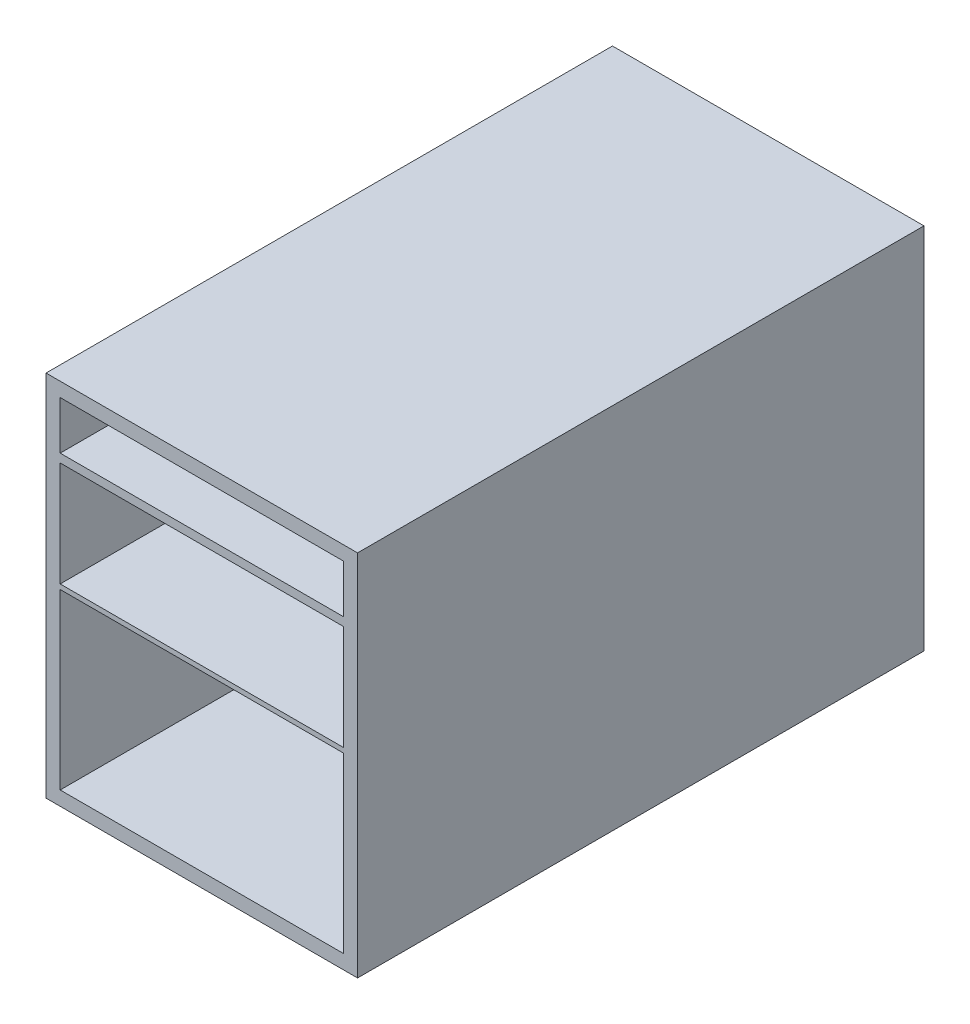
ISO-10303-21;
HEADER;
FILE_DESCRIPTION(('STEP AP214'),'2;1');
FILE_NAME('part.step','',(''),(''),'','','');
FILE_SCHEMA(('AUTOMOTIVE_DESIGN { 1 0 10303 214 1 1 1 1 }'));
ENDSEC;
DATA;
#1=APPLICATION_CONTEXT('core data for automotive mechanical design processes');
#2=APPLICATION_PROTOCOL_DEFINITION('international standard','automotive_design',2000,#1);
#3=PRODUCT_CONTEXT('',#1,'mechanical');
#4=PRODUCT('Part','Part','',(#3));
#5=PRODUCT_RELATED_PRODUCT_CATEGORY('part','',(#4));
#6=PRODUCT_DEFINITION_FORMATION('','',#4);
#7=PRODUCT_DEFINITION_CONTEXT('part definition',#1,'design');
#8=PRODUCT_DEFINITION('design','',#6,#7);
#9=PRODUCT_DEFINITION_SHAPE('','',#8);
#10=(LENGTH_UNIT() NAMED_UNIT(*) SI_UNIT(.MILLI.,.METRE.));
#11=(NAMED_UNIT(*) PLANE_ANGLE_UNIT() SI_UNIT($,.RADIAN.));
#12=(NAMED_UNIT(*) SI_UNIT($,.STERADIAN.) SOLID_ANGLE_UNIT());
#13=UNCERTAINTY_MEASURE_WITH_UNIT(LENGTH_MEASURE(1.E-05),#10,'distance_accuracy_value','');
#14=(GEOMETRIC_REPRESENTATION_CONTEXT(3) GLOBAL_UNCERTAINTY_ASSIGNED_CONTEXT((#13)) GLOBAL_UNIT_ASSIGNED_CONTEXT((#10,
#11,#12)) REPRESENTATION_CONTEXT('',''));
#15=CARTESIAN_POINT('',(0.,0.,0.));
#16=DIRECTION('',(0.,0.,1.));
#17=DIRECTION('',(1.,0.,0.));
#18=AXIS2_PLACEMENT_3D('',#15,#16,#17);
#19=CARTESIAN_POINT('',(-50.,-65.,200.));
#20=DIRECTION('',(1.,0.,0.));
#21=DIRECTION('',(0.,1.,0.));
#22=AXIS2_PLACEMENT_3D('',#19,#20,#21);
#23=PLANE('',#22);
#24=DIRECTION('',(0.,0.,-1.));
#25=VECTOR('',#24,1.);
#26=CARTESIAN_POINT('',(-50.,40.,200.));
#27=LINE('',#26,#25);
#28=CARTESIAN_POINT('',(-50.,40.,200.));
#29=VERTEX_POINT('',#28);
#30=CARTESIAN_POINT('',(-50.,40.,5.));
#31=VERTEX_POINT('',#30);
#32=EDGE_CURVE('E50',#29,#31,#27,.T.);
#33=ORIENTED_EDGE('',*,*,#32,.F.);
#34=DIRECTION('',(0.,-1.,0.));
#35=VECTOR('',#34,1.);
#36=CARTESIAN_POINT('',(-50.,-65.,200.));
#37=LINE('',#36,#35);
#38=CARTESIAN_POINT('',(-50.,3.,200.));
#39=VERTEX_POINT('',#38);
#40=EDGE_CURVE('E217',#29,#39,#37,.T.);
#41=ORIENTED_EDGE('',*,*,#40,.T.);
#42=DIRECTION('',(0.,0.,1.));
#43=VECTOR('',#42,1.);
#44=CARTESIAN_POINT('',(-50.,3.,200.));
#45=LINE('',#44,#43);
#46=CARTESIAN_POINT('',(-50.,3.,5.));
#47=VERTEX_POINT('',#46);
#48=EDGE_CURVE('E241',#47,#39,#45,.T.);
#49=ORIENTED_EDGE('',*,*,#48,.F.);
#50=DIRECTION('',(0.,-1.,0.));
#51=VECTOR('',#50,1.);
#52=CARTESIAN_POINT('',(-50.,-65.,5.));
#53=LINE('',#52,#51);
#54=EDGE_CURVE('E158',#31,#47,#53,.T.);
#55=ORIENTED_EDGE('',*,*,#54,.F.);
#56=EDGE_LOOP('',(#33,#41,#49,#55));
#57=FACE_BOUND('',#56,.T.);
#58=ADVANCED_FACE('F35',(#57),#23,.T.);
#59=CARTESIAN_POINT('',(50.,-65.,200.));
#60=DIRECTION('',(-1.,0.,0.));
#61=DIRECTION('',(0.,0.,1.));
#62=AXIS2_PLACEMENT_3D('',#59,#60,#61);
#63=PLANE('',#62);
#64=DIRECTION('',(0.,0.,1.));
#65=VECTOR('',#64,1.);
#66=CARTESIAN_POINT('',(50.,40.,200.));
#67=LINE('',#66,#65);
#68=CARTESIAN_POINT('',(50.,40.,5.));
#69=VERTEX_POINT('',#68);
#70=CARTESIAN_POINT('',(50.,40.,200.));
#71=VERTEX_POINT('',#70);
#72=EDGE_CURVE('E166',#69,#71,#67,.T.);
#73=ORIENTED_EDGE('',*,*,#72,.F.);
#74=DIRECTION('',(0.,1.,0.));
#75=VECTOR('',#74,1.);
#76=CARTESIAN_POINT('',(50.,-65.,5.));
#77=LINE('',#76,#75);
#78=CARTESIAN_POINT('',(50.,2.99999999999999,5.));
#79=VERTEX_POINT('',#78);
#80=EDGE_CURVE('E227',#79,#69,#77,.T.);
#81=ORIENTED_EDGE('',*,*,#80,.F.);
#82=DIRECTION('',(0.,0.,-1.));
#83=VECTOR('',#82,1.);
#84=CARTESIAN_POINT('',(50.,2.99999999999999,200.));
#85=LINE('',#84,#83);
#86=CARTESIAN_POINT('',(50.,2.99999999999999,200.));
#87=VERTEX_POINT('',#86);
#88=EDGE_CURVE('E244',#87,#79,#85,.T.);
#89=ORIENTED_EDGE('',*,*,#88,.F.);
#90=DIRECTION('',(0.,1.,0.));
#91=VECTOR('',#90,1.);
#92=CARTESIAN_POINT('',(50.,-65.,200.));
#93=LINE('',#92,#91);
#94=EDGE_CURVE('E212',#87,#71,#93,.T.);
#95=ORIENTED_EDGE('',*,*,#94,.T.);
#96=EDGE_LOOP('',(#73,#81,#89,#95));
#97=FACE_BOUND('',#96,.T.);
#98=ADVANCED_FACE('F297',(#97),#63,.T.);
#99=CARTESIAN_POINT('',(0.,0.,5.));
#100=DIRECTION('',(0.,0.,1.));
#101=DIRECTION('',(1.,0.,0.));
#102=AXIS2_PLACEMENT_3D('',#99,#100,#101);
#103=PLANE('',#102);
#104=DIRECTION('',(1.,0.,0.));
#105=VECTOR('',#104,1.);
#106=CARTESIAN_POINT('',(0.,40.,5.));
#107=LINE('',#106,#105);
#108=EDGE_CURVE('E11',#31,#69,#107,.T.);
#109=ORIENTED_EDGE('',*,*,#108,.F.);
#110=ORIENTED_EDGE('',*,*,#54,.T.);
#111=DIRECTION('',(-1.,0.,0.));
#112=VECTOR('',#111,1.);
#113=CARTESIAN_POINT('',(0.,2.99999999999999,5.));
#114=LINE('',#113,#112);
#115=EDGE_CURVE('E173',#79,#47,#114,.T.);
#116=ORIENTED_EDGE('',*,*,#115,.F.);
#117=ORIENTED_EDGE('',*,*,#80,.T.);
#118=EDGE_LOOP('',(#109,#110,#116,#117));
#119=FACE_BOUND('',#118,.T.);
#120=ADVANCED_FACE('F291',(#119),#103,.T.);
#121=DIRECTION('',(0.,0.,-1.));
#122=VECTOR('',#121,1.);
#123=CARTESIAN_POINT('',(-50.,1.30000000000016,200.));
#124=LINE('',#123,#122);
#125=CARTESIAN_POINT('',(-50.,1.30000000000016,200.));
#126=VERTEX_POINT('',#125);
#127=CARTESIAN_POINT('',(-50.,1.30000000000015,5.));
#128=VERTEX_POINT('',#127);
#129=EDGE_CURVE('E235',#126,#128,#124,.T.);
#130=ORIENTED_EDGE('',*,*,#129,.F.);
#131=CARTESIAN_POINT('',(-50.,-60.,200.));
#132=VERTEX_POINT('',#131);
#133=EDGE_CURVE('E218',#126,#132,#37,.T.);
#134=ORIENTED_EDGE('',*,*,#133,.T.);
#135=DIRECTION('',(0.,0.,-1.));
#136=VECTOR('',#135,1.);
#137=CARTESIAN_POINT('',(-50.,-60.,200.));
#138=LINE('',#137,#136);
#139=CARTESIAN_POINT('',(-50.,-60.,5.));
#140=VERTEX_POINT('',#139);
#141=EDGE_CURVE('E200',#132,#140,#138,.T.);
#142=ORIENTED_EDGE('',*,*,#141,.T.);
#143=EDGE_CURVE('E160',#128,#140,#53,.T.);
#144=ORIENTED_EDGE('',*,*,#143,.F.);
#145=EDGE_LOOP('',(#130,#134,#142,#144));
#146=FACE_BOUND('',#145,.T.);
#147=ADVANCED_FACE('F273',(#146),#23,.T.);
#148=DIRECTION('',(0.,0.,1.));
#149=VECTOR('',#148,1.);
#150=CARTESIAN_POINT('',(50.,1.30000000000013,200.));
#151=LINE('',#150,#149);
#152=CARTESIAN_POINT('',(50.,1.30000000000015,5.));
#153=VERTEX_POINT('',#152);
#154=CARTESIAN_POINT('',(50.,1.30000000000013,200.));
#155=VERTEX_POINT('',#154);
#156=EDGE_CURVE('E238',#153,#155,#151,.T.);
#157=ORIENTED_EDGE('',*,*,#156,.F.);
#158=CARTESIAN_POINT('',(50.,-60.,5.));
#159=VERTEX_POINT('',#158);
#160=EDGE_CURVE('E220',#159,#153,#77,.T.);
#161=ORIENTED_EDGE('',*,*,#160,.F.);
#162=DIRECTION('',(0.,0.,-1.));
#163=VECTOR('',#162,1.);
#164=CARTESIAN_POINT('',(50.,-60.,200.));
#165=LINE('',#164,#163);
#166=CARTESIAN_POINT('',(50.,-60.,200.));
#167=VERTEX_POINT('',#166);
#168=EDGE_CURVE('E224',#167,#159,#165,.T.);
#169=ORIENTED_EDGE('',*,*,#168,.F.);
#170=EDGE_CURVE('E210',#167,#155,#93,.T.);
#171=ORIENTED_EDGE('',*,*,#170,.T.);
#172=EDGE_LOOP('',(#157,#161,#169,#171));
#173=FACE_BOUND('',#172,.T.);
#174=ADVANCED_FACE('F284',(#173),#63,.T.);
#175=DIRECTION('',(1.,0.,0.));
#176=VECTOR('',#175,1.);
#177=CARTESIAN_POINT('',(0.,1.30000000000015,5.));
#178=LINE('',#177,#176);
#179=EDGE_CURVE('E171',#128,#153,#178,.T.);
#180=ORIENTED_EDGE('',*,*,#179,.F.);
#181=ORIENTED_EDGE('',*,*,#143,.T.);
#182=DIRECTION('',(1.,0.,0.));
#183=VECTOR('',#182,1.);
#184=CARTESIAN_POINT('',(55.,-60.,5.));
#185=LINE('',#184,#183);
#186=EDGE_CURVE('E157',#140,#159,#185,.T.);
#187=ORIENTED_EDGE('',*,*,#186,.T.);
#188=ORIENTED_EDGE('',*,*,#160,.T.);
#189=EDGE_LOOP('',(#180,#181,#187,#188));
#190=FACE_BOUND('',#189,.T.);
#191=ADVANCED_FACE('F289',(#190),#103,.T.);
#192=CARTESIAN_POINT('',(-55.,-65.,200.));
#193=DIRECTION('',(1.,0.,0.));
#194=DIRECTION('',(0.,1.,0.));
#195=AXIS2_PLACEMENT_3D('',#192,#193,#194);
#196=PLANE('',#195);
#197=DIRECTION('',(0.,-1.,0.));
#198=VECTOR('',#197,1.);
#199=CARTESIAN_POINT('',(-55.,-65.,0.));
#200=LINE('',#199,#198);
#201=CARTESIAN_POINT('',(-55.,65.,0.));
#202=VERTEX_POINT('',#201);
#203=CARTESIAN_POINT('',(-55.,-65.,0.));
#204=VERTEX_POINT('',#203);
#205=EDGE_CURVE('E198',#202,#204,#200,.T.);
#206=ORIENTED_EDGE('',*,*,#205,.T.);
#207=DIRECTION('',(0.,0.,-1.));
#208=VECTOR('',#207,1.);
#209=CARTESIAN_POINT('',(-55.,-65.,200.));
#210=LINE('',#209,#208);
#211=CARTESIAN_POINT('',(-55.,-65.,200.));
#212=VERTEX_POINT('',#211);
#213=EDGE_CURVE('E178',#212,#204,#210,.T.);
#214=ORIENTED_EDGE('',*,*,#213,.F.);
#215=DIRECTION('',(0.,-1.,0.));
#216=VECTOR('',#215,1.);
#217=CARTESIAN_POINT('',(-55.,-65.,200.));
#218=LINE('',#217,#216);
#219=CARTESIAN_POINT('',(-55.,65.,200.));
#220=VERTEX_POINT('',#219);
#221=EDGE_CURVE('E193',#220,#212,#218,.T.);
#222=ORIENTED_EDGE('',*,*,#221,.F.);
#223=DIRECTION('',(0.,0.,-1.));
#224=VECTOR('',#223,1.);
#225=CARTESIAN_POINT('',(-55.,65.,200.));
#226=LINE('',#225,#224);
#227=EDGE_CURVE('E187',#220,#202,#226,.T.);
#228=ORIENTED_EDGE('',*,*,#227,.T.);
#229=EDGE_LOOP('',(#206,#214,#222,#228));
#230=FACE_BOUND('',#229,.T.);
#231=ADVANCED_FACE('F37',(#230),#196,.F.);
#232=CARTESIAN_POINT('',(55.,-65.,200.));
#233=DIRECTION('',(0.,1.,0.));
#234=DIRECTION('',(-1.,0.,0.));
#235=AXIS2_PLACEMENT_3D('',#232,#233,#234);
#236=PLANE('',#235);
#237=DIRECTION('',(1.,0.,0.));
#238=VECTOR('',#237,1.);
#239=CARTESIAN_POINT('',(55.,-65.,0.));
#240=LINE('',#239,#238);
#241=CARTESIAN_POINT('',(55.,-65.,0.));
#242=VERTEX_POINT('',#241);
#243=EDGE_CURVE('E196',#204,#242,#240,.T.);
#244=ORIENTED_EDGE('',*,*,#243,.T.);
#245=DIRECTION('',(0.,0.,-1.));
#246=VECTOR('',#245,1.);
#247=CARTESIAN_POINT('',(55.,-65.,200.));
#248=LINE('',#247,#246);
#249=CARTESIAN_POINT('',(55.,-65.,200.));
#250=VERTEX_POINT('',#249);
#251=EDGE_CURVE('E181',#250,#242,#248,.T.);
#252=ORIENTED_EDGE('',*,*,#251,.F.);
#253=DIRECTION('',(1.,0.,0.));
#254=VECTOR('',#253,1.);
#255=CARTESIAN_POINT('',(55.,-65.,200.));
#256=LINE('',#255,#254);
#257=EDGE_CURVE('E204',#212,#250,#256,.T.);
#258=ORIENTED_EDGE('',*,*,#257,.F.);
#259=ORIENTED_EDGE('',*,*,#213,.T.);
#260=EDGE_LOOP('',(#244,#252,#258,#259));
#261=FACE_BOUND('',#260,.T.);
#262=ADVANCED_FACE('F326',(#261),#236,.F.);
#263=CARTESIAN_POINT('',(55.,-65.,200.));
#264=DIRECTION('',(-1.,0.,0.));
#265=DIRECTION('',(0.,0.,1.));
#266=AXIS2_PLACEMENT_3D('',#263,#264,#265);
#267=PLANE('',#266);
#268=DIRECTION('',(0.,0.,-1.));
#269=VECTOR('',#268,1.);
#270=CARTESIAN_POINT('',(55.,65.,200.));
#271=LINE('',#270,#269);
#272=CARTESIAN_POINT('',(55.,65.,200.));
#273=VERTEX_POINT('',#272);
#274=CARTESIAN_POINT('',(55.,65.,0.));
#275=VERTEX_POINT('',#274);
#276=EDGE_CURVE('E184',#273,#275,#271,.T.);
#277=ORIENTED_EDGE('',*,*,#276,.F.);
#278=DIRECTION('',(0.,1.,0.));
#279=VECTOR('',#278,1.);
#280=CARTESIAN_POINT('',(55.,-65.,200.));
#281=LINE('',#280,#279);
#282=EDGE_CURVE('E202',#250,#273,#281,.T.);
#283=ORIENTED_EDGE('',*,*,#282,.F.);
#284=ORIENTED_EDGE('',*,*,#251,.T.);
#285=DIRECTION('',(0.,1.,0.));
#286=VECTOR('',#285,1.);
#287=CARTESIAN_POINT('',(55.,-65.,0.));
#288=LINE('',#287,#286);
#289=EDGE_CURVE('E194',#242,#275,#288,.T.);
#290=ORIENTED_EDGE('',*,*,#289,.T.);
#291=EDGE_LOOP('',(#277,#283,#284,#290));
#292=FACE_BOUND('',#291,.T.);
#293=ADVANCED_FACE('F317',(#292),#267,.F.);
#294=CARTESIAN_POINT('',(55.,65.,200.));
#295=DIRECTION('',(0.,-1.,0.));
#296=DIRECTION('',(0.,0.,-1.));
#297=AXIS2_PLACEMENT_3D('',#294,#295,#296);
#298=PLANE('',#297);
#299=DIRECTION('',(-1.,0.,0.));
#300=VECTOR('',#299,1.);
#301=CARTESIAN_POINT('',(55.,65.,0.));
#302=LINE('',#301,#300);
#303=EDGE_CURVE('E191',#275,#202,#302,.T.);
#304=ORIENTED_EDGE('',*,*,#303,.T.);
#305=ORIENTED_EDGE('',*,*,#227,.F.);
#306=DIRECTION('',(-1.,0.,0.));
#307=VECTOR('',#306,1.);
#308=CARTESIAN_POINT('',(55.,65.,200.));
#309=LINE('',#308,#307);
#310=EDGE_CURVE('E190',#273,#220,#309,.T.);
#311=ORIENTED_EDGE('',*,*,#310,.F.);
#312=ORIENTED_EDGE('',*,*,#276,.T.);
#313=EDGE_LOOP('',(#304,#305,#311,#312));
#314=FACE_BOUND('',#313,.T.);
#315=ADVANCED_FACE('F308',(#314),#298,.F.);
#316=CARTESIAN_POINT('',(0.,0.,200.));
#317=DIRECTION('',(0.,0.,1.));
#318=DIRECTION('',(1.,0.,0.));
#319=AXIS2_PLACEMENT_3D('',#316,#317,#318);
#320=PLANE('',#319);
#321=ORIENTED_EDGE('',*,*,#40,.F.);
#322=DIRECTION('',(-1.,0.,0.));
#323=VECTOR('',#322,1.);
#324=CARTESIAN_POINT('',(-55.,40.,200.));
#325=LINE('',#324,#323);
#326=EDGE_CURVE('E259',#71,#29,#325,.T.);
#327=ORIENTED_EDGE('',*,*,#326,.F.);
#328=ORIENTED_EDGE('',*,*,#94,.F.);
#329=DIRECTION('',(1.,0.,0.));
#330=VECTOR('',#329,1.);
#331=CARTESIAN_POINT('',(-55.,3.,200.));
#332=LINE('',#331,#330);
#333=EDGE_CURVE('E247',#39,#87,#332,.T.);
#334=ORIENTED_EDGE('',*,*,#333,.F.);
#335=EDGE_LOOP('',(#321,#327,#328,#334));
#336=FACE_BOUND('',#335,.T.);
#337=CARTESIAN_POINT('',(50.,43.,200.));
#338=VERTEX_POINT('',#337);
#339=CARTESIAN_POINT('',(50.,60.,200.));
#340=VERTEX_POINT('',#339);
#341=EDGE_CURVE('E213',#338,#340,#93,.T.);
#342=ORIENTED_EDGE('',*,*,#341,.F.);
#343=DIRECTION('',(1.,0.,0.));
#344=VECTOR('',#343,1.);
#345=CARTESIAN_POINT('',(-55.,43.0000000000001,200.));
#346=LINE('',#345,#344);
#347=CARTESIAN_POINT('',(-50.,43.0000000000001,200.));
#348=VERTEX_POINT('',#347);
#349=EDGE_CURVE('E257',#348,#338,#346,.T.);
#350=ORIENTED_EDGE('',*,*,#349,.F.);
#351=CARTESIAN_POINT('',(-50.,60.,200.));
#352=VERTEX_POINT('',#351);
#353=EDGE_CURVE('E58',#352,#348,#37,.T.);
#354=ORIENTED_EDGE('',*,*,#353,.F.);
#355=DIRECTION('',(-1.,0.,0.));
#356=VECTOR('',#355,1.);
#357=CARTESIAN_POINT('',(55.,60.,200.));
#358=LINE('',#357,#356);
#359=EDGE_CURVE('E207',#340,#352,#358,.T.);
#360=ORIENTED_EDGE('',*,*,#359,.F.);
#361=EDGE_LOOP('',(#342,#350,#354,#360));
#362=FACE_BOUND('',#361,.T.);
#363=ORIENTED_EDGE('',*,*,#282,.T.);
#364=ORIENTED_EDGE('',*,*,#310,.T.);
#365=ORIENTED_EDGE('',*,*,#221,.T.);
#366=ORIENTED_EDGE('',*,*,#257,.T.);
#367=EDGE_LOOP('',(#363,#364,#365,#366));
#368=FACE_BOUND('',#367,.T.);
#369=ORIENTED_EDGE('',*,*,#133,.F.);
#370=DIRECTION('',(-1.,0.,0.));
#371=VECTOR('',#370,1.);
#372=CARTESIAN_POINT('',(-55.,1.30000000000016,200.));
#373=LINE('',#372,#371);
#374=EDGE_CURVE('E250',#155,#126,#373,.T.);
#375=ORIENTED_EDGE('',*,*,#374,.F.);
#376=ORIENTED_EDGE('',*,*,#170,.F.);
#377=DIRECTION('',(1.,0.,0.));
#378=VECTOR('',#377,1.);
#379=CARTESIAN_POINT('',(55.,-60.,200.));
#380=LINE('',#379,#378);
#381=EDGE_CURVE('E214',#132,#167,#380,.T.);
#382=ORIENTED_EDGE('',*,*,#381,.F.);
#383=EDGE_LOOP('',(#369,#375,#376,#382));
#384=FACE_BOUND('',#383,.T.);
#385=ADVANCED_FACE('F266',(#336,#362,#368,#384),#320,.T.);
#386=CARTESIAN_POINT('',(0.,0.,0.));
#387=DIRECTION('',(0.,0.,1.));
#388=DIRECTION('',(1.,0.,0.));
#389=AXIS2_PLACEMENT_3D('',#386,#387,#388);
#390=PLANE('',#389);
#391=ORIENTED_EDGE('',*,*,#303,.F.);
#392=ORIENTED_EDGE('',*,*,#289,.F.);
#393=ORIENTED_EDGE('',*,*,#243,.F.);
#394=ORIENTED_EDGE('',*,*,#205,.F.);
#395=EDGE_LOOP('',(#391,#392,#393,#394));
#396=FACE_BOUND('',#395,.T.);
#397=ADVANCED_FACE('F307',(#396),#390,.F.);
#398=DIRECTION('',(0.,0.,1.));
#399=VECTOR('',#398,1.);
#400=CARTESIAN_POINT('',(-50.,43.0000000000001,200.));
#401=LINE('',#400,#399);
#402=CARTESIAN_POINT('',(-50.,43.0000000000001,5.));
#403=VERTEX_POINT('',#402);
#404=EDGE_CURVE('E161',#403,#348,#401,.T.);
#405=ORIENTED_EDGE('',*,*,#404,.F.);
#406=CARTESIAN_POINT('',(-50.,60.,5.));
#407=VERTEX_POINT('',#406);
#408=EDGE_CURVE('E150',#407,#403,#53,.T.);
#409=ORIENTED_EDGE('',*,*,#408,.F.);
#410=DIRECTION('',(0.,0.,-1.));
#411=VECTOR('',#410,1.);
#412=CARTESIAN_POINT('',(-50.,60.,200.));
#413=LINE('',#412,#411);
#414=EDGE_CURVE('E209',#352,#407,#413,.T.);
#415=ORIENTED_EDGE('',*,*,#414,.F.);
#416=ORIENTED_EDGE('',*,*,#353,.T.);
#417=EDGE_LOOP('',(#405,#409,#415,#416));
#418=FACE_BOUND('',#417,.T.);
#419=ADVANCED_FACE('F162',(#418),#23,.T.);
#420=CARTESIAN_POINT('',(55.,-60.,200.));
#421=DIRECTION('',(0.,1.,0.));
#422=DIRECTION('',(-1.,0.,0.));
#423=AXIS2_PLACEMENT_3D('',#420,#421,#422);
#424=PLANE('',#423);
#425=ORIENTED_EDGE('',*,*,#186,.F.);
#426=ORIENTED_EDGE('',*,*,#141,.F.);
#427=ORIENTED_EDGE('',*,*,#381,.T.);
#428=ORIENTED_EDGE('',*,*,#168,.T.);
#429=EDGE_LOOP('',(#425,#426,#427,#428));
#430=FACE_BOUND('',#429,.T.);
#431=ADVANCED_FACE('F280',(#430),#424,.T.);
#432=DIRECTION('',(0.,0.,-1.));
#433=VECTOR('',#432,1.);
#434=CARTESIAN_POINT('',(50.,43.,200.));
#435=LINE('',#434,#433);
#436=CARTESIAN_POINT('',(50.,43.,5.));
#437=VERTEX_POINT('',#436);
#438=EDGE_CURVE('E167',#338,#437,#435,.T.);
#439=ORIENTED_EDGE('',*,*,#438,.F.);
#440=ORIENTED_EDGE('',*,*,#341,.T.);
#441=DIRECTION('',(0.,0.,-1.));
#442=VECTOR('',#441,1.);
#443=CARTESIAN_POINT('',(50.,60.,200.));
#444=LINE('',#443,#442);
#445=CARTESIAN_POINT('',(50.,60.,5.));
#446=VERTEX_POINT('',#445);
#447=EDGE_CURVE('E221',#340,#446,#444,.T.);
#448=ORIENTED_EDGE('',*,*,#447,.T.);
#449=EDGE_CURVE('E228',#437,#446,#77,.T.);
#450=ORIENTED_EDGE('',*,*,#449,.F.);
#451=EDGE_LOOP('',(#439,#440,#448,#450));
#452=FACE_BOUND('',#451,.T.);
#453=ADVANCED_FACE('F300',(#452),#63,.T.);
#454=CARTESIAN_POINT('',(55.,60.,200.));
#455=DIRECTION('',(0.,-1.,0.));
#456=DIRECTION('',(0.,0.,-1.));
#457=AXIS2_PLACEMENT_3D('',#454,#455,#456);
#458=PLANE('',#457);
#459=DIRECTION('',(-1.,0.,0.));
#460=VECTOR('',#459,1.);
#461=CARTESIAN_POINT('',(55.,60.,5.));
#462=LINE('',#461,#460);
#463=EDGE_CURVE('E155',#446,#407,#462,.T.);
#464=ORIENTED_EDGE('',*,*,#463,.F.);
#465=ORIENTED_EDGE('',*,*,#447,.F.);
#466=ORIENTED_EDGE('',*,*,#359,.T.);
#467=ORIENTED_EDGE('',*,*,#414,.T.);
#468=EDGE_LOOP('',(#464,#465,#466,#467));
#469=FACE_BOUND('',#468,.T.);
#470=ADVANCED_FACE('F304',(#469),#458,.T.);
#471=DIRECTION('',(-1.,0.,0.));
#472=VECTOR('',#471,1.);
#473=CARTESIAN_POINT('',(0.,43.,5.));
#474=LINE('',#473,#472);
#475=EDGE_CURVE('E43',#437,#403,#474,.T.);
#476=ORIENTED_EDGE('',*,*,#475,.F.);
#477=ORIENTED_EDGE('',*,*,#449,.T.);
#478=ORIENTED_EDGE('',*,*,#463,.T.);
#479=ORIENTED_EDGE('',*,*,#408,.T.);
#480=EDGE_LOOP('',(#476,#477,#478,#479));
#481=FACE_BOUND('',#480,.T.);
#482=ADVANCED_FACE('F151',(#481),#103,.T.);
#483=CARTESIAN_POINT('',(-55.,1.30000000000016,310.013135579348));
#484=DIRECTION('',(0.,-1.,0.));
#485=DIRECTION('',(1.,0.,0.));
#486=AXIS2_PLACEMENT_3D('',#483,#484,#485);
#487=PLANE('',#486);
#488=ORIENTED_EDGE('',*,*,#374,.T.);
#489=ORIENTED_EDGE('',*,*,#129,.T.);
#490=ORIENTED_EDGE('',*,*,#179,.T.);
#491=ORIENTED_EDGE('',*,*,#156,.T.);
#492=EDGE_LOOP('',(#488,#489,#490,#491));
#493=FACE_BOUND('',#492,.T.);
#494=ADVANCED_FACE('F287',(#493),#487,.T.);
#495=CARTESIAN_POINT('',(-55.,3.,310.013135579348));
#496=DIRECTION('',(0.,1.,0.));
#497=DIRECTION('',(-1.,0.,0.));
#498=AXIS2_PLACEMENT_3D('',#495,#496,#497);
#499=PLANE('',#498);
#500=ORIENTED_EDGE('',*,*,#115,.T.);
#501=ORIENTED_EDGE('',*,*,#48,.T.);
#502=ORIENTED_EDGE('',*,*,#333,.T.);
#503=ORIENTED_EDGE('',*,*,#88,.T.);
#504=EDGE_LOOP('',(#500,#501,#502,#503));
#505=FACE_BOUND('',#504,.T.);
#506=ADVANCED_FACE('F295',(#505),#499,.T.);
#507=CARTESIAN_POINT('',(-55.,40.,310.040901486674));
#508=DIRECTION('',(0.,-1.,0.));
#509=DIRECTION('',(1.,0.,0.));
#510=AXIS2_PLACEMENT_3D('',#507,#508,#509);
#511=PLANE('',#510);
#512=ORIENTED_EDGE('',*,*,#326,.T.);
#513=ORIENTED_EDGE('',*,*,#32,.T.);
#514=ORIENTED_EDGE('',*,*,#108,.T.);
#515=ORIENTED_EDGE('',*,*,#72,.T.);
#516=EDGE_LOOP('',(#512,#513,#514,#515));
#517=FACE_BOUND('',#516,.T.);
#518=ADVANCED_FACE('F263',(#517),#511,.T.);
#519=CARTESIAN_POINT('',(-55.,43.0000000000001,310.040901486674));
#520=DIRECTION('',(0.,1.,0.));
#521=DIRECTION('',(-1.,0.,0.));
#522=AXIS2_PLACEMENT_3D('',#519,#520,#521);
#523=PLANE('',#522);
#524=ORIENTED_EDGE('',*,*,#475,.T.);
#525=ORIENTED_EDGE('',*,*,#404,.T.);
#526=ORIENTED_EDGE('',*,*,#349,.T.);
#527=ORIENTED_EDGE('',*,*,#438,.T.);
#528=EDGE_LOOP('',(#524,#525,#526,#527));
#529=FACE_BOUND('',#528,.T.);
#530=ADVANCED_FACE('F170',(#529),#523,.T.);
#531=CLOSED_SHELL('',(#58,#98,#120,#147,#174,#191,#231,#262,#293,#315,#385,#397,#419,#431,#453,
#470,#482,#494,#506,#518,#530));
#532=MANIFOLD_SOLID_BREP('B2',#531);
#533=ADVANCED_BREP_SHAPE_REPRESENTATION('',(#18,#532),#14);
#534=SHAPE_DEFINITION_REPRESENTATION(#9,#533);
ENDSEC;
END-ISO-10303-21;
